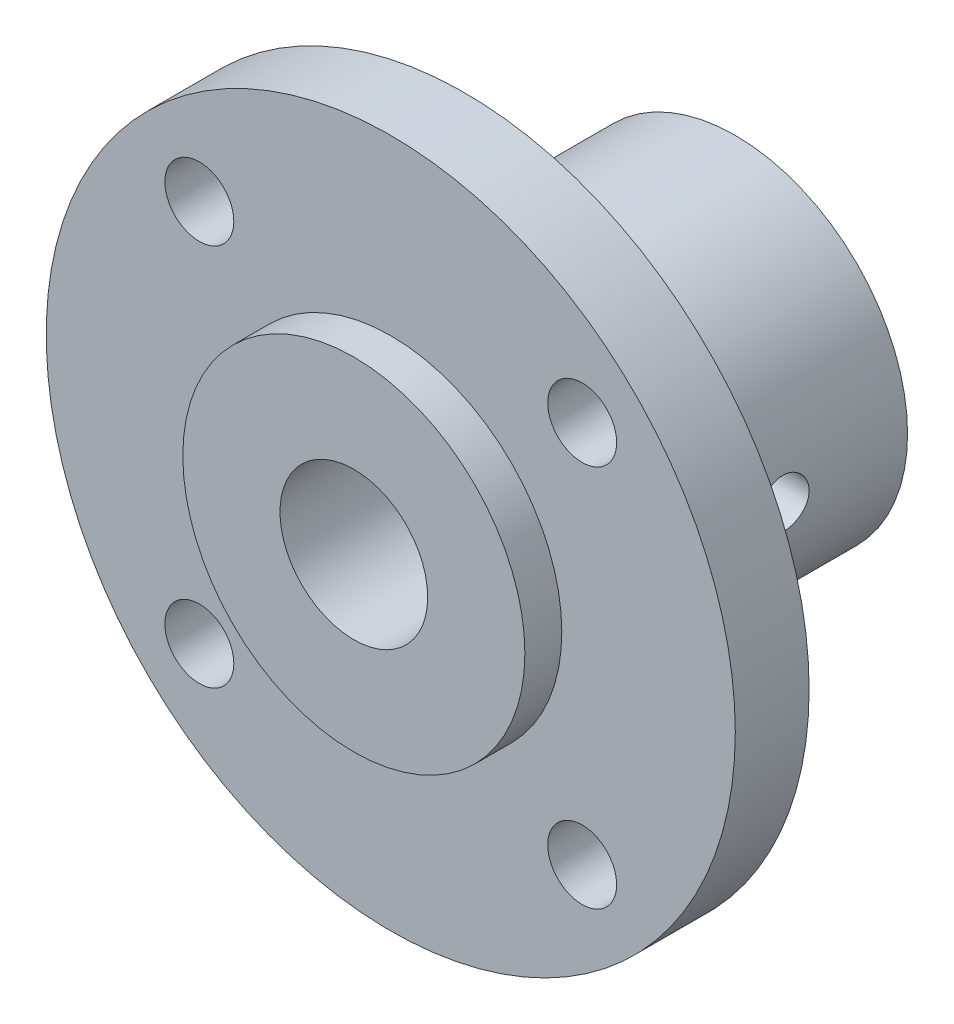
ISO-10303-21;
HEADER;
FILE_DESCRIPTION(('STEP AP214'),'2;1');
FILE_NAME('part.step','',(''),(''),'','','');
FILE_SCHEMA(('AUTOMOTIVE_DESIGN { 1 0 10303 214 1 1 1 1 }'));
ENDSEC;
DATA;
#1=APPLICATION_CONTEXT('core data for automotive mechanical design processes');
#2=APPLICATION_PROTOCOL_DEFINITION('international standard','automotive_design',2000,#1);
#3=PRODUCT_CONTEXT('',#1,'mechanical');
#4=PRODUCT('Part','Part','',(#3));
#5=PRODUCT_RELATED_PRODUCT_CATEGORY('part','',(#4));
#6=PRODUCT_DEFINITION_FORMATION('','',#4);
#7=PRODUCT_DEFINITION_CONTEXT('part definition',#1,'design');
#8=PRODUCT_DEFINITION('design','',#6,#7);
#9=PRODUCT_DEFINITION_SHAPE('','',#8);
#10=(LENGTH_UNIT() NAMED_UNIT(*) SI_UNIT(.MILLI.,.METRE.));
#11=(NAMED_UNIT(*) PLANE_ANGLE_UNIT() SI_UNIT($,.RADIAN.));
#12=(NAMED_UNIT(*) SI_UNIT($,.STERADIAN.) SOLID_ANGLE_UNIT());
#13=UNCERTAINTY_MEASURE_WITH_UNIT(LENGTH_MEASURE(1.E-05),#10,'distance_accuracy_value','');
#14=(GEOMETRIC_REPRESENTATION_CONTEXT(3) GLOBAL_UNCERTAINTY_ASSIGNED_CONTEXT((#13)) GLOBAL_UNIT_ASSIGNED_CONTEXT((#10,
#11,#12)) REPRESENTATION_CONTEXT('',''));
#15=CARTESIAN_POINT('',(0.,0.,0.));
#16=DIRECTION('',(0.,0.,1.));
#17=DIRECTION('',(1.,0.,0.));
#18=AXIS2_PLACEMENT_3D('',#15,#16,#17);
#19=CARTESIAN_POINT('',(0.,0.,3.));
#20=DIRECTION('',(0.,0.,-1.));
#21=DIRECTION('',(-1.,0.,0.));
#22=AXIS2_PLACEMENT_3D('',#19,#20,#21);
#23=CYLINDRICAL_SURFACE('',#22,14.);
#24=CARTESIAN_POINT('',(0.,0.,3.));
#25=DIRECTION('',(0.,0.,1.));
#26=DIRECTION('',(1.,0.,0.));
#27=AXIS2_PLACEMENT_3D('',#24,#25,#26);
#28=CIRCLE('',#27,14.);
#29=CARTESIAN_POINT('',(14.,0.,3.));
#30=VERTEX_POINT('',#29);
#31=EDGE_CURVE('E51',#30,#30,#28,.T.);
#32=ORIENTED_EDGE('',*,*,#31,.F.);
#33=EDGE_LOOP('',(#32));
#34=FACE_BOUND('',#33,.T.);
#35=CARTESIAN_POINT('',(0.,0.,0.));
#36=DIRECTION('',(0.,0.,1.));
#37=DIRECTION('',(1.,0.,0.));
#38=AXIS2_PLACEMENT_3D('',#35,#36,#37);
#39=CIRCLE('',#38,14.);
#40=CARTESIAN_POINT('',(14.,0.,0.));
#41=VERTEX_POINT('',#40);
#42=EDGE_CURVE('E57',#41,#41,#39,.T.);
#43=ORIENTED_EDGE('',*,*,#42,.T.);
#44=EDGE_LOOP('',(#43));
#45=FACE_BOUND('',#44,.T.);
#46=ADVANCED_FACE('F39',(#34,#45),#23,.T.);
#47=CARTESIAN_POINT('',(0.,0.,3.));
#48=DIRECTION('',(0.,0.,1.));
#49=DIRECTION('',(1.,0.,0.));
#50=AXIS2_PLACEMENT_3D('',#47,#48,#49);
#51=PLANE('',#50);
#52=CARTESIAN_POINT('',(7.77817459305202,-7.77817459305202,3.));
#53=DIRECTION('',(0.,0.,1.));
#54=DIRECTION('',(1.,0.,0.));
#55=AXIS2_PLACEMENT_3D('',#52,#53,#54);
#56=CIRCLE('',#55,1.4);
#57=CARTESIAN_POINT('',(9.17817459305202,-7.77817459305202,3.));
#58=VERTEX_POINT('',#57);
#59=EDGE_CURVE('E241',#58,#58,#56,.T.);
#60=ORIENTED_EDGE('',*,*,#59,.F.);
#61=EDGE_LOOP('',(#60));
#62=FACE_BOUND('',#61,.T.);
#63=CARTESIAN_POINT('',(-7.77817459305202,-7.77817459305202,3.));
#64=DIRECTION('',(0.,0.,1.));
#65=DIRECTION('',(1.,0.,0.));
#66=AXIS2_PLACEMENT_3D('',#63,#64,#65);
#67=CIRCLE('',#66,1.4);
#68=CARTESIAN_POINT('',(-6.37817459305202,-7.77817459305202,3.));
#69=VERTEX_POINT('',#68);
#70=EDGE_CURVE('E253',#69,#69,#67,.T.);
#71=ORIENTED_EDGE('',*,*,#70,.F.);
#72=EDGE_LOOP('',(#71));
#73=FACE_BOUND('',#72,.T.);
#74=CARTESIAN_POINT('',(-7.77817459305202,7.77817459305202,3.));
#75=DIRECTION('',(0.,0.,1.));
#76=DIRECTION('',(1.,0.,0.));
#77=AXIS2_PLACEMENT_3D('',#74,#75,#76);
#78=CIRCLE('',#77,1.4);
#79=CARTESIAN_POINT('',(-6.37817459305202,7.77817459305202,3.));
#80=VERTEX_POINT('',#79);
#81=EDGE_CURVE('E266',#80,#80,#78,.T.);
#82=ORIENTED_EDGE('',*,*,#81,.F.);
#83=EDGE_LOOP('',(#82));
#84=FACE_BOUND('',#83,.T.);
#85=CARTESIAN_POINT('',(7.77817459305202,7.77817459305202,3.));
#86=DIRECTION('',(0.,0.,1.));
#87=DIRECTION('',(1.,0.,0.));
#88=AXIS2_PLACEMENT_3D('',#85,#86,#87);
#89=CIRCLE('',#88,1.4);
#90=CARTESIAN_POINT('',(9.17817459305203,7.77817459305202,3.));
#91=VERTEX_POINT('',#90);
#92=EDGE_CURVE('E267',#91,#91,#89,.T.);
#93=ORIENTED_EDGE('',*,*,#92,.F.);
#94=EDGE_LOOP('',(#93));
#95=FACE_BOUND('',#94,.T.);
#96=CARTESIAN_POINT('',(0.,0.,3.));
#97=DIRECTION('',(0.,0.,1.));
#98=DIRECTION('',(1.,0.,0.));
#99=AXIS2_PLACEMENT_3D('',#96,#97,#98);
#100=CIRCLE('',#99,6.95);
#101=CARTESIAN_POINT('',(6.95,0.,3.));
#102=VERTEX_POINT('',#101);
#103=EDGE_CURVE('E10',#102,#102,#100,.T.);
#104=ORIENTED_EDGE('',*,*,#103,.F.);
#105=EDGE_LOOP('',(#104));
#106=FACE_BOUND('',#105,.T.);
#107=ORIENTED_EDGE('',*,*,#31,.T.);
#108=EDGE_LOOP('',(#107));
#109=FACE_BOUND('',#108,.T.);
#110=ADVANCED_FACE('F115',(#62,#73,#84,#95,#106,#109),#51,.T.);
#111=CARTESIAN_POINT('',(0.,0.,0.));
#112=DIRECTION('',(0.,0.,1.));
#113=DIRECTION('',(1.,0.,0.));
#114=AXIS2_PLACEMENT_3D('',#111,#112,#113);
#115=PLANE('',#114);
#116=CARTESIAN_POINT('',(7.77817459305202,-7.77817459305202,0.));
#117=DIRECTION('',(0.,0.,-1.));
#118=DIRECTION('',(-1.,0.,0.));
#119=AXIS2_PLACEMENT_3D('',#116,#117,#118);
#120=CIRCLE('',#119,1.4);
#121=CARTESIAN_POINT('',(6.37817459305202,-7.77817459305202,0.));
#122=VERTEX_POINT('',#121);
#123=EDGE_CURVE('E276',#122,#122,#120,.T.);
#124=ORIENTED_EDGE('',*,*,#123,.F.);
#125=EDGE_LOOP('',(#124));
#126=FACE_BOUND('',#125,.T.);
#127=CARTESIAN_POINT('',(-7.77817459305202,-7.77817459305202,0.));
#128=DIRECTION('',(0.,0.,-1.));
#129=DIRECTION('',(-1.,0.,0.));
#130=AXIS2_PLACEMENT_3D('',#127,#128,#129);
#131=CIRCLE('',#130,1.4);
#132=CARTESIAN_POINT('',(-9.17817459305203,-7.77817459305202,0.));
#133=VERTEX_POINT('',#132);
#134=EDGE_CURVE('E278',#133,#133,#131,.T.);
#135=ORIENTED_EDGE('',*,*,#134,.F.);
#136=EDGE_LOOP('',(#135));
#137=FACE_BOUND('',#136,.T.);
#138=CARTESIAN_POINT('',(-7.77817459305202,7.77817459305202,0.));
#139=DIRECTION('',(0.,0.,-1.));
#140=DIRECTION('',(-1.,0.,0.));
#141=AXIS2_PLACEMENT_3D('',#138,#139,#140);
#142=CIRCLE('',#141,1.4);
#143=CARTESIAN_POINT('',(-9.17817459305202,7.77817459305202,0.));
#144=VERTEX_POINT('',#143);
#145=EDGE_CURVE('E274',#144,#144,#142,.T.);
#146=ORIENTED_EDGE('',*,*,#145,.F.);
#147=EDGE_LOOP('',(#146));
#148=FACE_BOUND('',#147,.T.);
#149=CARTESIAN_POINT('',(7.77817459305202,7.77817459305202,0.));
#150=DIRECTION('',(0.,0.,-1.));
#151=DIRECTION('',(-1.,0.,0.));
#152=AXIS2_PLACEMENT_3D('',#149,#150,#151);
#153=CIRCLE('',#152,1.4);
#154=CARTESIAN_POINT('',(6.37817459305202,7.77817459305202,0.));
#155=VERTEX_POINT('',#154);
#156=EDGE_CURVE('E275',#155,#155,#153,.T.);
#157=ORIENTED_EDGE('',*,*,#156,.F.);
#158=EDGE_LOOP('',(#157));
#159=FACE_BOUND('',#158,.T.);
#160=CARTESIAN_POINT('',(0.,0.,0.));
#161=DIRECTION('',(0.,0.,1.));
#162=DIRECTION('',(1.,0.,0.));
#163=AXIS2_PLACEMENT_3D('',#160,#161,#162);
#164=CIRCLE('',#163,7.);
#165=CARTESIAN_POINT('',(7.,0.,0.));
#166=VERTEX_POINT('',#165);
#167=EDGE_CURVE('E247',#166,#166,#164,.T.);
#168=ORIENTED_EDGE('',*,*,#167,.T.);
#169=EDGE_LOOP('',(#168));
#170=FACE_BOUND('',#169,.T.);
#171=ORIENTED_EDGE('',*,*,#42,.F.);
#172=EDGE_LOOP('',(#171));
#173=FACE_BOUND('',#172,.T.);
#174=ADVANCED_FACE('F109',(#126,#137,#148,#159,#170,#173),#115,.F.);
#175=CARTESIAN_POINT('',(0.,0.,4.5));
#176=DIRECTION('',(0.,0.,-1.));
#177=DIRECTION('',(-1.,0.,0.));
#178=AXIS2_PLACEMENT_3D('',#175,#176,#177);
#179=CYLINDRICAL_SURFACE('',#178,6.95);
#180=CARTESIAN_POINT('',(0.,0.,4.5));
#181=DIRECTION('',(0.,0.,1.));
#182=DIRECTION('',(1.,0.,0.));
#183=AXIS2_PLACEMENT_3D('',#180,#181,#182);
#184=CIRCLE('',#183,6.95);
#185=CARTESIAN_POINT('',(6.95,0.,4.5));
#186=VERTEX_POINT('',#185);
#187=EDGE_CURVE('E56',#186,#186,#184,.T.);
#188=ORIENTED_EDGE('',*,*,#187,.F.);
#189=EDGE_LOOP('',(#188));
#190=FACE_BOUND('',#189,.T.);
#191=ORIENTED_EDGE('',*,*,#103,.T.);
#192=EDGE_LOOP('',(#191));
#193=FACE_BOUND('',#192,.T.);
#194=ADVANCED_FACE('F108',(#190,#193),#179,.T.);
#195=CARTESIAN_POINT('',(0.,0.,4.5));
#196=DIRECTION('',(0.,0.,1.));
#197=DIRECTION('',(1.,0.,0.));
#198=AXIS2_PLACEMENT_3D('',#195,#196,#197);
#199=PLANE('',#198);
#200=CARTESIAN_POINT('',(0.,0.,4.5));
#201=DIRECTION('',(0.,0.,1.));
#202=DIRECTION('',(1.,0.,0.));
#203=AXIS2_PLACEMENT_3D('',#200,#201,#202);
#204=CIRCLE('',#203,3.);
#205=CARTESIAN_POINT('',(3.,0.,4.5));
#206=VERTEX_POINT('',#205);
#207=EDGE_CURVE('E236',#206,#206,#204,.T.);
#208=ORIENTED_EDGE('',*,*,#207,.F.);
#209=EDGE_LOOP('',(#208));
#210=FACE_BOUND('',#209,.T.);
#211=ORIENTED_EDGE('',*,*,#187,.T.);
#212=EDGE_LOOP('',(#211));
#213=FACE_BOUND('',#212,.T.);
#214=ADVANCED_FACE('F103',(#210,#213),#199,.T.);
#215=CARTESIAN_POINT('',(0.,0.,0.));
#216=DIRECTION('',(0.,0.,1.));
#217=DIRECTION('',(1.,0.,0.));
#218=AXIS2_PLACEMENT_3D('',#215,#216,#217);
#219=CYLINDRICAL_SURFACE('',#218,3.);
#220=CARTESIAN_POINT('',(3.,0.,-7.));
#221=CARTESIAN_POINT('',(3.00000015300943,0.0545633628867233,-7.00000025373164));
#222=CARTESIAN_POINT('',(2.99849769507545,0.10912519453855,-6.99551973387278));
#223=CARTESIAN_POINT('',(2.99265210203281,0.216641760872972,-6.97777089118278));
#224=CARTESIAN_POINT('',(2.98830867202153,0.269596328118818,-6.96450165605108));
#225=CARTESIAN_POINT('',(2.97725307906443,0.372332789501776,-6.92968075661595));
#226=CARTESIAN_POINT('',(2.97054487730853,0.422119825886034,-6.90814293754073));
#227=CARTESIAN_POINT('',(2.95544445717342,0.517374936805325,-6.85745882716165));
#228=CARTESIAN_POINT('',(2.94705190667778,0.562842156958706,-6.8283110349974));
#229=CARTESIAN_POINT('',(2.92914094443005,0.649741675022266,-6.76217419514125));
#230=CARTESIAN_POINT('',(2.91959556463785,0.691003700298309,-6.72496876573951));
#231=CARTESIAN_POINT('',(2.90060314783122,0.766832692702084,-6.64423284529343));
#232=CARTESIAN_POINT('',(2.89115613290549,0.801398185489462,-6.60070096507149));
#233=CARTESIAN_POINT('',(2.87313332477274,0.863824942227859,-6.50701488480354));
#234=CARTESIAN_POINT('',(2.86459039275688,0.891464858221032,-6.45670626026788));
#235=CARTESIAN_POINT('',(2.84975305418601,0.937818873877721,-6.35182390554145));
#236=CARTESIAN_POINT('',(2.84345796160746,0.956535697386765,-6.29725148283726));
#237=CARTESIAN_POINT('',(2.83411303269377,0.983873461509163,-6.18732677850329));
#238=CARTESIAN_POINT('',(2.83096095769611,0.992813448271769,-6.13206279151093));
#239=CARTESIAN_POINT('',(2.82795656629508,1.00134112333448,-6.02073624584412));
#240=CARTESIAN_POINT('',(2.8281032302273,1.00093170160472,-5.96467393929081));
#241=CARTESIAN_POINT('',(2.8315901500818,0.991019903703419,-5.85606336955598));
#242=CARTESIAN_POINT('',(2.83478415867533,0.981933913166995,-5.80347159708098));
#243=CARTESIAN_POINT('',(2.84376657724551,0.955606162849417,-5.70060658039317));
#244=CARTESIAN_POINT('',(2.84955529784108,0.938363426591871,-5.65033361456493));
#245=CARTESIAN_POINT('',(2.86317911131249,0.895939058060212,-5.55258725040852));
#246=CARTESIAN_POINT('',(2.87104565793117,0.870634048707263,-5.50517197453047));
#247=CARTESIAN_POINT('',(2.88792558575726,0.812889106303139,-5.41512909172028));
#248=CARTESIAN_POINT('',(2.89693929790464,0.780447112364006,-5.37250287306662));
#249=CARTESIAN_POINT('',(2.91567329167741,0.707349332682238,-5.29090840183923));
#250=CARTESIAN_POINT('',(2.92540589354843,0.666353150076312,-5.25224730549093));
#251=CARTESIAN_POINT('',(2.94406938387037,0.578339569970064,-5.1822687333366));
#252=CARTESIAN_POINT('',(2.95300019538067,0.531321595660815,-5.1509519618355));
#253=CARTESIAN_POINT('',(2.96917107937794,0.431947613046268,-5.09630369976493));
#254=CARTESIAN_POINT('',(2.97639350008039,0.379543276416337,-5.07305450865927));
#255=CARTESIAN_POINT('',(2.98820567144435,0.271269083364508,-5.03579682604429));
#256=CARTESIAN_POINT('',(2.99279633654879,0.215400438154954,-5.02178512457656));
#257=CARTESIAN_POINT('',(2.99867627071441,0.104383829529304,-5.00394433397764));
#258=CARTESIAN_POINT('',(3.00010001833731,0.0493095998648454,-4.99970019082725));
#259=CARTESIAN_POINT('',(2.99988902694825,-0.0607750699602364,-5.00033267359847));
#260=CARTESIAN_POINT('',(2.99825480419352,-0.115785519319647,-5.00520775997987));
#261=CARTESIAN_POINT('',(2.99220024717114,-0.222519866304259,-5.02361190773597));
#262=CARTESIAN_POINT('',(2.98786198711228,-0.274292806834856,-5.03688620604952));
#263=CARTESIAN_POINT('',(2.97691846830034,-0.374855958579561,-5.0713934444667));
#264=CARTESIAN_POINT('',(2.97031292046541,-0.423645788508559,-5.09262739946768));
#265=CARTESIAN_POINT('',(2.95528931287427,-0.518288296393321,-5.1430704318409));
#266=CARTESIAN_POINT('',(2.94682814756305,-0.564029959217329,-5.1724745932836));
#267=CARTESIAN_POINT('',(2.92905253915743,-0.650064830135404,-5.23819415001305));
#268=CARTESIAN_POINT('',(2.91973783591888,-0.690356367794894,-5.27451165603016));
#269=CARTESIAN_POINT('',(2.90076847982472,-0.766252507807013,-5.35497875100826));
#270=CARTESIAN_POINT('',(2.89111761095155,-0.801560969248491,-5.39940922693325));
#271=CARTESIAN_POINT('',(2.87299973286981,-0.864257522320854,-5.4937715678045));
#272=CARTESIAN_POINT('',(2.8645327335312,-0.891645547920843,-5.5437034786102));
#273=CARTESIAN_POINT('',(2.84982391820308,-0.937596930423361,-5.6476730153066));
#274=CARTESIAN_POINT('',(2.84357760900632,-0.956178132197766,-5.70170207924278));
#275=CARTESIAN_POINT('',(2.83410832399133,-0.983894666792163,-5.81237865012415));
#276=CARTESIAN_POINT('',(2.83088398622698,-0.993034254961243,-5.86902496543306));
#277=CARTESIAN_POINT('',(2.82797858875071,-1.00127628247038,-5.98019709601321));
#278=CARTESIAN_POINT('',(2.82812400344299,-1.00087025731093,-6.03468234025174));
#279=CARTESIAN_POINT('',(2.8315126992356,-0.991242293454878,-6.14276507489974));
#280=CARTESIAN_POINT('',(2.83475579595884,-0.982020879458887,-6.19636261795291));
#281=CARTESIAN_POINT('',(2.84384524278943,-0.95537181312698,-6.30013566301267));
#282=CARTESIAN_POINT('',(2.84964098015514,-0.93810334601488,-6.35035682500723));
#283=CARTESIAN_POINT('',(2.86316398825434,-0.895979365760382,-6.44722740693553));
#284=CARTESIAN_POINT('',(2.87089168765297,-0.871122168553979,-6.49387603118726));
#285=CARTESIAN_POINT('',(2.8878282922406,-0.813260692583249,-6.58448366992369));
#286=CARTESIAN_POINT('',(2.89708711641604,-0.779948242764532,-6.62823650189859));
#287=CARTESIAN_POINT('',(2.91583356283786,-0.706642883135697,-6.70968981338399));
#288=CARTESIAN_POINT('',(2.92532124912518,-0.666648084451495,-6.74738857568802));
#289=CARTESIAN_POINT('',(2.94390030525393,-0.579241556920674,-6.81714441228924));
#290=CARTESIAN_POINT('',(2.95296181801216,-0.531601513499725,-6.84892434775102));
#291=CARTESIAN_POINT('',(2.96925991172652,-0.431357357406628,-6.90399042885063));
#292=CARTESIAN_POINT('',(2.9764969590794,-0.378754518132349,-6.92727874592204));
#293=CARTESIAN_POINT('',(2.98805515068532,-0.272493647200975,-6.96372163248868));
#294=CARTESIAN_POINT('',(2.9924921242252,-0.218987757676408,-6.97728246626338));
#295=CARTESIAN_POINT('',(2.99846407064225,-0.110320416010247,-6.99542028067713));
#296=CARTESIAN_POINT('',(2.99999984531906,-0.0551594255687463,-6.99999974349654));
#297=CARTESIAN_POINT('',(3.,0.,-7.));
#298=B_SPLINE_CURVE_WITH_KNOTS('',3,(#220,#221,#222,#223,#224,#225,#226,#227,#228,#229,#230,
#231,#232,#233,#234,#235,#236,#237,#238,#239,#240,#241,#242,#243,#244,#245,#246,#247,#248,#249,
#250,#251,#252,#253,#254,#255,#256,#257,#258,#259,#260,#261,#262,#263,#264,#265,#266,#267,#268,
#269,#270,#271,#272,#273,#274,#275,#276,#277,#278,#279,#280,#281,#282,#283,#284,#285,#286,#287,
#288,#289,#290,#291,#292,#293,#294,#295,#296,#297),.UNSPECIFIED.,.T.,.F.,(4,2,2,2,2,2,2,2,2,2,2,
2,2,2,2,2,2,2,2,2,2,2,2,2,2,2,2,2,2,2,2,2,2,2,2,2,2,2,4),(0.,0.163487106026011,
0.326991185267521,0.490222672870274,0.6534863777991,0.82184684282756,0.990244332875302,
1.1634838482347,1.33667044692833,1.5040192574184,1.67131633987485,1.8309682655128,
1.99063930855482,2.15288171155131,2.31517102558207,2.48593305811367,2.65671145966618,
2.82918405650357,3.00159668877208,3.1665358317517,3.33144713164177,3.49158157978213,
3.65173645284104,3.81610399843736,3.98052180821891,4.15241022880752,4.32430008234997,
4.49584013824417,4.66730284700846,4.82995666056619,4.99260079341185,5.15215587070227,
5.31174638165788,5.47830066681615,5.64490211113589,5.8179966082491,5.99104681142266,
6.15636558363624,6.3216386602795),.UNSPECIFIED.);
#299=CARTESIAN_POINT('',(3.,0.,-7.));
#300=VERTEX_POINT('',#299);
#301=EDGE_CURVE('E92',#300,#300,#298,.T.);
#302=ORIENTED_EDGE('',*,*,#301,.T.);
#303=EDGE_LOOP('',(#302));
#304=FACE_BOUND('',#303,.T.);
#305=CARTESIAN_POINT('',(-3.,0.,-7.));
#306=CARTESIAN_POINT('',(-3.00000015300943,-0.0545633628867233,-7.00000025373164));
#307=CARTESIAN_POINT('',(-2.99849769507545,-0.10912519453855,-6.99551973387278));
#308=CARTESIAN_POINT('',(-2.99265210203281,-0.216641760872972,-6.97777089118278));
#309=CARTESIAN_POINT('',(-2.98830867202153,-0.269596328118818,-6.96450165605108));
#310=CARTESIAN_POINT('',(-2.97725307906443,-0.372332789501776,-6.92968075661595));
#311=CARTESIAN_POINT('',(-2.97054487730853,-0.422119825886034,-6.90814293754073));
#312=CARTESIAN_POINT('',(-2.95544445717342,-0.517374936805325,-6.85745882716165));
#313=CARTESIAN_POINT('',(-2.94705190667778,-0.562842156958706,-6.8283110349974));
#314=CARTESIAN_POINT('',(-2.92914094443005,-0.649741675022266,-6.76217419514125));
#315=CARTESIAN_POINT('',(-2.91959556463785,-0.691003700298309,-6.72496876573951));
#316=CARTESIAN_POINT('',(-2.90060314783122,-0.766832692702084,-6.64423284529343));
#317=CARTESIAN_POINT('',(-2.89115613290549,-0.801398185489462,-6.60070096507149));
#318=CARTESIAN_POINT('',(-2.87313332477274,-0.863824942227859,-6.50701488480354));
#319=CARTESIAN_POINT('',(-2.86459039275688,-0.891464858221032,-6.45670626026788));
#320=CARTESIAN_POINT('',(-2.84975305418601,-0.937818873877721,-6.35182390554145));
#321=CARTESIAN_POINT('',(-2.84345796160746,-0.956535697386765,-6.29725148283726));
#322=CARTESIAN_POINT('',(-2.83411303269377,-0.983873461509163,-6.18732677850329));
#323=CARTESIAN_POINT('',(-2.83096095769611,-0.992813448271769,-6.13206279151093));
#324=CARTESIAN_POINT('',(-2.82795656629508,-1.00134112333448,-6.02073624584412));
#325=CARTESIAN_POINT('',(-2.8281032302273,-1.00093170160472,-5.96467393929081));
#326=CARTESIAN_POINT('',(-2.8315901500818,-0.991019903703419,-5.85606336955598));
#327=CARTESIAN_POINT('',(-2.83478415867533,-0.981933913166995,-5.80347159708098));
#328=CARTESIAN_POINT('',(-2.84376657724551,-0.955606162849417,-5.70060658039317));
#329=CARTESIAN_POINT('',(-2.84955529784108,-0.938363426591871,-5.65033361456493));
#330=CARTESIAN_POINT('',(-2.86317911131249,-0.895939058060212,-5.55258725040852));
#331=CARTESIAN_POINT('',(-2.87104565793117,-0.870634048707263,-5.50517197453047));
#332=CARTESIAN_POINT('',(-2.88792558575726,-0.812889106303139,-5.41512909172028));
#333=CARTESIAN_POINT('',(-2.89693929790464,-0.780447112364006,-5.37250287306662));
#334=CARTESIAN_POINT('',(-2.91567329167741,-0.707349332682238,-5.29090840183923));
#335=CARTESIAN_POINT('',(-2.92540589354843,-0.666353150076312,-5.25224730549093));
#336=CARTESIAN_POINT('',(-2.94406938387037,-0.578339569970064,-5.1822687333366));
#337=CARTESIAN_POINT('',(-2.95300019538067,-0.531321595660815,-5.1509519618355));
#338=CARTESIAN_POINT('',(-2.96917107937794,-0.431947613046268,-5.09630369976493));
#339=CARTESIAN_POINT('',(-2.97639350008039,-0.379543276416337,-5.07305450865927));
#340=CARTESIAN_POINT('',(-2.98820567144435,-0.271269083364508,-5.03579682604429));
#341=CARTESIAN_POINT('',(-2.99279633654879,-0.215400438154954,-5.02178512457656));
#342=CARTESIAN_POINT('',(-2.99867627071441,-0.104383829529304,-5.00394433397764));
#343=CARTESIAN_POINT('',(-3.00010001833731,-0.0493095998648454,-4.99970019082725));
#344=CARTESIAN_POINT('',(-2.99988902694825,0.0607750699602364,-5.00033267359847));
#345=CARTESIAN_POINT('',(-2.99825480419352,0.115785519319647,-5.00520775997987));
#346=CARTESIAN_POINT('',(-2.99220024717114,0.222519866304259,-5.02361190773597));
#347=CARTESIAN_POINT('',(-2.98786198711228,0.274292806834856,-5.03688620604952));
#348=CARTESIAN_POINT('',(-2.97691846830034,0.374855958579561,-5.0713934444667));
#349=CARTESIAN_POINT('',(-2.97031292046541,0.423645788508559,-5.09262739946768));
#350=CARTESIAN_POINT('',(-2.95528931287427,0.518288296393321,-5.1430704318409));
#351=CARTESIAN_POINT('',(-2.94682814756305,0.564029959217329,-5.1724745932836));
#352=CARTESIAN_POINT('',(-2.92905253915743,0.650064830135404,-5.23819415001305));
#353=CARTESIAN_POINT('',(-2.91973783591888,0.690356367794894,-5.27451165603016));
#354=CARTESIAN_POINT('',(-2.90076847982472,0.766252507807013,-5.35497875100826));
#355=CARTESIAN_POINT('',(-2.89111761095155,0.801560969248491,-5.39940922693325));
#356=CARTESIAN_POINT('',(-2.87299973286981,0.864257522320854,-5.4937715678045));
#357=CARTESIAN_POINT('',(-2.8645327335312,0.891645547920843,-5.5437034786102));
#358=CARTESIAN_POINT('',(-2.84982391820308,0.937596930423361,-5.6476730153066));
#359=CARTESIAN_POINT('',(-2.84357760900632,0.956178132197766,-5.70170207924278));
#360=CARTESIAN_POINT('',(-2.83410832399133,0.983894666792163,-5.81237865012415));
#361=CARTESIAN_POINT('',(-2.83088398622698,0.993034254961243,-5.86902496543306));
#362=CARTESIAN_POINT('',(-2.82797858875071,1.00127628247038,-5.98019709601321));
#363=CARTESIAN_POINT('',(-2.82812400344299,1.00087025731093,-6.03468234025174));
#364=CARTESIAN_POINT('',(-2.8315126992356,0.991242293454878,-6.14276507489974));
#365=CARTESIAN_POINT('',(-2.83475579595884,0.982020879458887,-6.19636261795291));
#366=CARTESIAN_POINT('',(-2.84384524278943,0.95537181312698,-6.30013566301267));
#367=CARTESIAN_POINT('',(-2.84964098015514,0.93810334601488,-6.35035682500723));
#368=CARTESIAN_POINT('',(-2.86316398825434,0.895979365760382,-6.44722740693553));
#369=CARTESIAN_POINT('',(-2.87089168765297,0.871122168553979,-6.49387603118726));
#370=CARTESIAN_POINT('',(-2.8878282922406,0.813260692583249,-6.58448366992369));
#371=CARTESIAN_POINT('',(-2.89708711641604,0.779948242764532,-6.62823650189859));
#372=CARTESIAN_POINT('',(-2.91583356283786,0.706642883135697,-6.70968981338399));
#373=CARTESIAN_POINT('',(-2.92532124912518,0.666648084451495,-6.74738857568802));
#374=CARTESIAN_POINT('',(-2.94390030525393,0.579241556920674,-6.81714441228924));
#375=CARTESIAN_POINT('',(-2.95296181801216,0.531601513499725,-6.84892434775102));
#376=CARTESIAN_POINT('',(-2.96925991172652,0.431357357406628,-6.90399042885063));
#377=CARTESIAN_POINT('',(-2.9764969590794,0.378754518132349,-6.92727874592204));
#378=CARTESIAN_POINT('',(-2.98805515068532,0.272493647200975,-6.96372163248868));
#379=CARTESIAN_POINT('',(-2.9924921242252,0.218987757676408,-6.97728246626338));
#380=CARTESIAN_POINT('',(-2.99846407064225,0.110320416010247,-6.99542028067713));
#381=CARTESIAN_POINT('',(-2.99999984531906,0.0551594255687463,-6.99999974349654));
#382=CARTESIAN_POINT('',(-3.,0.,-7.));
#383=B_SPLINE_CURVE_WITH_KNOTS('',3,(#305,#306,#307,#308,#309,#310,#311,#312,#313,#314,#315,
#316,#317,#318,#319,#320,#321,#322,#323,#324,#325,#326,#327,#328,#329,#330,#331,#332,#333,#334,
#335,#336,#337,#338,#339,#340,#341,#342,#343,#344,#345,#346,#347,#348,#349,#350,#351,#352,#353,
#354,#355,#356,#357,#358,#359,#360,#361,#362,#363,#364,#365,#366,#367,#368,#369,#370,#371,#372,
#373,#374,#375,#376,#377,#378,#379,#380,#381,#382),.UNSPECIFIED.,.T.,.F.,(4,2,2,2,2,2,2,2,2,2,2,
2,2,2,2,2,2,2,2,2,2,2,2,2,2,2,2,2,2,2,2,2,2,2,2,2,2,2,4),(0.,0.163487106026011,
0.326991185267521,0.490222672870274,0.6534863777991,0.82184684282756,0.990244332875302,
1.1634838482347,1.33667044692833,1.5040192574184,1.67131633987485,1.8309682655128,
1.99063930855482,2.15288171155131,2.31517102558207,2.48593305811367,2.65671145966618,
2.82918405650357,3.00159668877208,3.1665358317517,3.33144713164177,3.49158157978213,
3.65173645284104,3.81610399843736,3.98052180821891,4.15241022880752,4.32430008234997,
4.49584013824417,4.66730284700846,4.82995666056619,4.99260079341185,5.15215587070227,
5.31174638165788,5.47830066681615,5.64490211113589,5.8179966082491,5.99104681142266,
6.15636558363624,6.3216386602795),.UNSPECIFIED.);
#384=CARTESIAN_POINT('',(-3.,0.,-7.));
#385=VERTEX_POINT('',#384);
#386=EDGE_CURVE('E87',#385,#385,#383,.T.);
#387=ORIENTED_EDGE('',*,*,#386,.T.);
#388=EDGE_LOOP('',(#387));
#389=FACE_BOUND('',#388,.T.);
#390=ORIENTED_EDGE('',*,*,#207,.T.);
#391=EDGE_LOOP('',(#390));
#392=FACE_BOUND('',#391,.T.);
#393=CARTESIAN_POINT('',(0.,0.,-11.));
#394=DIRECTION('',(0.,0.,1.));
#395=DIRECTION('',(1.,0.,0.));
#396=AXIS2_PLACEMENT_3D('',#393,#394,#395);
#397=CIRCLE('',#396,3.);
#398=CARTESIAN_POINT('',(3.,0.,-11.));
#399=VERTEX_POINT('',#398);
#400=EDGE_CURVE('E245',#399,#399,#397,.T.);
#401=ORIENTED_EDGE('',*,*,#400,.F.);
#402=EDGE_LOOP('',(#401));
#403=FACE_BOUND('',#402,.T.);
#404=ADVANCED_FACE('F98',(#304,#389,#392,#403),#219,.F.);
#405=CARTESIAN_POINT('',(0.,0.,-11.));
#406=DIRECTION('',(0.,0.,1.));
#407=DIRECTION('',(1.,0.,0.));
#408=AXIS2_PLACEMENT_3D('',#405,#406,#407);
#409=PLANE('',#408);
#410=CARTESIAN_POINT('',(0.,0.,-11.));
#411=DIRECTION('',(0.,0.,1.));
#412=DIRECTION('',(1.,0.,0.));
#413=AXIS2_PLACEMENT_3D('',#410,#411,#412);
#414=CIRCLE('',#413,7.);
#415=CARTESIAN_POINT('',(7.,0.,-11.));
#416=VERTEX_POINT('',#415);
#417=EDGE_CURVE('E244',#416,#416,#414,.T.);
#418=ORIENTED_EDGE('',*,*,#417,.F.);
#419=EDGE_LOOP('',(#418));
#420=FACE_BOUND('',#419,.T.);
#421=ORIENTED_EDGE('',*,*,#400,.T.);
#422=EDGE_LOOP('',(#421));
#423=FACE_BOUND('',#422,.T.);
#424=ADVANCED_FACE('F96',(#420,#423),#409,.F.);
#425=CARTESIAN_POINT('',(0.,0.,0.));
#426=DIRECTION('',(0.,0.,-1.));
#427=DIRECTION('',(-1.,0.,0.));
#428=AXIS2_PLACEMENT_3D('',#425,#426,#427);
#429=CYLINDRICAL_SURFACE('',#428,7.);
#430=CARTESIAN_POINT('',(-7.,0.,-5.));
#431=CARTESIAN_POINT('',(-6.99999913522882,-0.0558653647064107,-5.00000232658881));
#432=CARTESIAN_POINT('',(-6.99932420200296,-0.111763905495517,-5.0046972071594));
#433=CARTESIAN_POINT('',(-6.99669670505877,-0.222000660368081,-5.02334913623399));
#434=CARTESIAN_POINT('',(-6.99474286996306,-0.276337265533478,-5.03731540177038));
#435=CARTESIAN_POINT('',(-6.98977730161823,-0.381838676785442,-5.07408606173423));
#436=CARTESIAN_POINT('',(-6.98676634168295,-0.433005769349771,-5.09688399682651));
#437=CARTESIAN_POINT('',(-6.98001989080586,-0.530779650240318,-5.15065554289536));
#438=CARTESIAN_POINT('',(-6.97628450765023,-0.57738711543865,-5.18162793784958));
#439=CARTESIAN_POINT('',(-6.96847539120891,-0.665058650397312,-5.25110417116727));
#440=CARTESIAN_POINT('',(-6.96439965767478,-0.706085590800651,-5.28965464285791));
#441=CARTESIAN_POINT('',(-6.95638499821218,-0.781111291768628,-5.37309241453966));
#442=CARTESIAN_POINT('',(-6.95244607987804,-0.815109662708697,-5.41798006559652));
#443=CARTESIAN_POINT('',(-6.94513156490684,-0.875255876422228,-5.51306511605375));
#444=CARTESIAN_POINT('',(-6.94175855199628,-0.901368125473883,-5.56328524628515));
#445=CARTESIAN_POINT('',(-6.93598482656287,-0.944773451668098,-5.66745453949105));
#446=CARTESIAN_POINT('',(-6.93358406600217,-0.962066964544983,-5.72140351807332));
#447=CARTESIAN_POINT('',(-6.93004619376593,-0.987229320061167,-5.83111000982802));
#448=CARTESIAN_POINT('',(-6.92890059523603,-0.995161488527954,-5.88685271992782));
#449=CARTESIAN_POINT('',(-6.92797693845422,-1.00157210007568,-5.9988889054348));
#450=CARTESIAN_POINT('',(-6.92819880887042,-1.00005103626979,-6.05518235196072));
#451=CARTESIAN_POINT('',(-6.9299772577103,-0.987650180979409,-6.16627654533307));
#452=CARTESIAN_POINT('',(-6.9315238110212,-0.976840681796494,-6.22108532204585));
#453=CARTESIAN_POINT('',(-6.93576171689508,-0.946279723214286,-6.32810308628426));
#454=CARTESIAN_POINT('',(-6.9384530990754,-0.926528032474813,-6.38031200651116));
#455=CARTESIAN_POINT('',(-6.94468857735278,-0.878569521249536,-6.48086327310843));
#456=CARTESIAN_POINT('',(-6.94823569081255,-0.85033269311634,-6.5291911123858));
#457=CARTESIAN_POINT('',(-6.95578073890064,-0.78622684572038,-6.6204492121893));
#458=CARTESIAN_POINT('',(-6.95977870039515,-0.750357371512553,-6.66337915072994));
#459=CARTESIAN_POINT('',(-6.9678193568045,-0.671617458714389,-6.74303040311463));
#460=CARTESIAN_POINT('',(-6.97186212884533,-0.628686537577609,-6.77969194505996));
#461=CARTESIAN_POINT('',(-6.97950317895594,-0.537249159400889,-6.84529850122326));
#462=CARTESIAN_POINT('',(-6.98310145539225,-0.48874268187249,-6.87424348708397));
#463=CARTESIAN_POINT('',(-6.98945135313469,-0.387481039813844,-6.92359743749929));
#464=CARTESIAN_POINT('',(-6.99220254306019,-0.334723727733655,-6.94400205474713));
#465=CARTESIAN_POINT('',(-6.99654459946019,-0.226483349377098,-6.97564546931975));
#466=CARTESIAN_POINT('',(-6.99813553702157,-0.171000450315641,-6.98688482819091));
#467=CARTESIAN_POINT('',(-6.99996847286368,-0.0594000111949729,-6.99979981341021));
#468=CARTESIAN_POINT('',(-7.00022206812239,-0.00329216977119572,-7.00155766323425));
#469=CARTESIAN_POINT('',(-6.9993832363385,0.108417425156647,-6.99567759598996));
#470=CARTESIAN_POINT('',(-6.99829084698658,0.164019192788029,-6.98803994201746));
#471=CARTESIAN_POINT('',(-6.99488996866151,0.272891208992244,-6.96365402920264));
#472=CARTESIAN_POINT('',(-6.99258679365044,0.326170552460061,-6.94694557041022));
#473=CARTESIAN_POINT('',(-6.98702187136217,0.429171472012341,-6.90493413035229));
#474=CARTESIAN_POINT('',(-6.98376008274315,0.47889289454054,-6.87963077841043));
#475=CARTESIAN_POINT('',(-6.97661188585467,0.573729847898929,-6.82095309150627));
#476=CARTESIAN_POINT('',(-6.97272147424604,0.618812606348984,-6.78752628514727));
#477=CARTESIAN_POINT('',(-6.96476223215387,0.70275764740243,-6.71362396197387));
#478=CARTESIAN_POINT('',(-6.96069339232073,0.741619603539291,-6.67314807545767));
#479=CARTESIAN_POINT('',(-6.95279940084852,0.812316823103834,-6.58593164951777));
#480=CARTESIAN_POINT('',(-6.94897630774254,0.844097150424188,-6.53914636484974));
#481=CARTESIAN_POINT('',(-6.94204235740405,0.899347843769572,-6.440853406698));
#482=CARTESIAN_POINT('',(-6.9389314823679,0.922818417525415,-6.38934585130419));
#483=CARTESIAN_POINT('',(-6.93378885130881,0.960697053792666,-6.28323834774686));
#484=CARTESIAN_POINT('',(-6.93175358189617,0.975134650659851,-6.22864912057935));
#485=CARTESIAN_POINT('',(-6.92898304632217,0.994631866000765,-6.1177897194722));
#486=CARTESIAN_POINT('',(-6.92824769941436,0.999692066965096,-6.06151965016116));
#487=CARTESIAN_POINT('',(-6.92816308872538,1.00027795187105,-5.94944308673935));
#488=CARTESIAN_POINT('',(-6.92880127161589,0.99588998683903,-5.89363703417234));
#489=CARTESIAN_POINT('',(-6.9313646210599,0.977888479253999,-5.78356493797077));
#490=CARTESIAN_POINT('',(-6.93328978628734,0.964274946206753,-5.72929889274949));
#491=CARTESIAN_POINT('',(-6.93820594738757,0.92823822782898,-5.62386736744441));
#492=CARTESIAN_POINT('',(-6.94119628108845,0.905820514813007,-5.57269998411848));
#493=CARTESIAN_POINT('',(-6.94790672863692,0.852820321015437,-5.4748387775233));
#494=CARTESIAN_POINT('',(-6.95162686252979,0.822237615959197,-5.4281450771843));
#495=CARTESIAN_POINT('',(-6.95941831326445,0.753459737315476,-5.34011709073554));
#496=CARTESIAN_POINT('',(-6.96349241131826,0.715200464701825,-5.29883312739888));
#497=CARTESIAN_POINT('',(-6.97150911027032,0.632290756660577,-5.22324014628389));
#498=CARTESIAN_POINT('',(-6.97545168026666,0.587638832167471,-5.18893275810575));
#499=CARTESIAN_POINT('',(-6.98278331246282,0.492951712266923,-5.12811621398193));
#500=CARTESIAN_POINT('',(-6.98616952559765,0.442890858727148,-5.10164667292105));
#501=CARTESIAN_POINT('',(-6.99197878037442,0.339010644185018,-5.05753012799695));
#502=CARTESIAN_POINT('',(-6.99440283401541,0.28519530259949,-5.03987384928381));
#503=CARTESIAN_POINT('',(-6.99745181502523,0.192605681998779,-5.01795820654369));
#504=CARTESIAN_POINT('',(-6.99840255428231,0.154406949589286,-5.01123398153088));
#505=CARTESIAN_POINT('',(-6.99967694328895,0.0774774606828314,-5.0022540954559));
#506=CARTESIAN_POINT('',(-7.00000059978196,0.0387467099115308,-4.99999838634076));
#507=CARTESIAN_POINT('',(-7.,0.,-5.));
#508=B_SPLINE_CURVE_WITH_KNOTS('',3,(#430,#431,#432,#433,#434,#435,#436,#437,#438,#439,#440,
#441,#442,#443,#444,#445,#446,#447,#448,#449,#450,#451,#452,#453,#454,#455,#456,#457,#458,#459,
#460,#461,#462,#463,#464,#465,#466,#467,#468,#469,#470,#471,#472,#473,#474,#475,#476,#477,#478,
#479,#480,#481,#482,#483,#484,#485,#486,#487,#488,#489,#490,#491,#492,#493,#494,#495,#496,#497,
#498,#499,#500,#501,#502,#503,#504,#505,#506,#507),.UNSPECIFIED.,.T.,.F.,(4,2,2,2,2,2,2,2,2,2,2,
2,2,2,2,2,2,2,2,2,2,2,2,2,2,2,2,2,2,2,2,2,2,2,2,2,2,2,4),(0.,0.167454526676438,
0.335075775995835,0.502574660696852,0.670048642505171,0.838587434288068,1.00713556641494,
1.17643344042558,1.34572294860658,1.51386059320977,1.68198946724779,1.84885708289861,
2.01572901576745,2.18319817810949,2.35067732527464,2.51967378353348,2.6886708628223,
2.85775386243831,3.02682650172624,3.19443056043042,3.3620299259403,3.5288997886847,
3.69577684902495,3.86376187993315,4.03175572377582,4.20101062362346,4.37026129206513,
4.53895564370424,4.70763951629676,4.87478825923561,5.0419368299494,5.20898167202542,
5.37603110293353,5.54453823754737,5.71308468724556,5.88246902499656,6.05167472923067,
6.1678179205788,6.28395986295406),.UNSPECIFIED.);
#509=CARTESIAN_POINT('',(-7.,0.,-5.));
#510=VERTEX_POINT('',#509);
#511=EDGE_CURVE('E45',#510,#510,#508,.T.);
#512=ORIENTED_EDGE('',*,*,#511,.T.);
#513=EDGE_LOOP('',(#512));
#514=FACE_BOUND('',#513,.T.);
#515=CARTESIAN_POINT('',(7.,0.,-7.));
#516=CARTESIAN_POINT('',(6.99999913522882,-0.0558653647064107,-6.99999767341119));
#517=CARTESIAN_POINT('',(6.99932420200296,-0.111763905495517,-6.9953027928406));
#518=CARTESIAN_POINT('',(6.99669670505877,-0.222000660368081,-6.97665086376601));
#519=CARTESIAN_POINT('',(6.99474286996306,-0.276337265533478,-6.96268459822962));
#520=CARTESIAN_POINT('',(6.98977730161823,-0.381838676785442,-6.92591393826577));
#521=CARTESIAN_POINT('',(6.98676634168295,-0.433005769349771,-6.90311600317349));
#522=CARTESIAN_POINT('',(6.98001989080586,-0.530779650240318,-6.84934445710464));
#523=CARTESIAN_POINT('',(6.97628450765023,-0.57738711543865,-6.81837206215042));
#524=CARTESIAN_POINT('',(6.96847539120891,-0.665058650397312,-6.74889582883273));
#525=CARTESIAN_POINT('',(6.96439965767478,-0.70608559080065,-6.71034535714209));
#526=CARTESIAN_POINT('',(6.95638499821218,-0.781111291768628,-6.62690758546034));
#527=CARTESIAN_POINT('',(6.95244607987804,-0.815109662708697,-6.58201993440348));
#528=CARTESIAN_POINT('',(6.94513156490684,-0.875255876422228,-6.48693488394625));
#529=CARTESIAN_POINT('',(6.94175855199628,-0.901368125473883,-6.43671475371485));
#530=CARTESIAN_POINT('',(6.93598482656287,-0.944773451668098,-6.33254546050895));
#531=CARTESIAN_POINT('',(6.93358406600217,-0.962066964544983,-6.27859648192668));
#532=CARTESIAN_POINT('',(6.93004619376593,-0.987229320061167,-6.16888999017198));
#533=CARTESIAN_POINT('',(6.92890059523603,-0.995161488527954,-6.11314728007218));
#534=CARTESIAN_POINT('',(6.92797693845422,-1.00157210007568,-6.0011110945652));
#535=CARTESIAN_POINT('',(6.92819880887042,-1.00005103626979,-5.94481764803928));
#536=CARTESIAN_POINT('',(6.9299772577103,-0.987650180979409,-5.83372345466693));
#537=CARTESIAN_POINT('',(6.9315238110212,-0.976840681796494,-5.77891467795415));
#538=CARTESIAN_POINT('',(6.93576171689508,-0.946279723214286,-5.67189691371574));
#539=CARTESIAN_POINT('',(6.9384530990754,-0.926528032474813,-5.61968799348884));
#540=CARTESIAN_POINT('',(6.94468857735278,-0.878569521249536,-5.51913672689157));
#541=CARTESIAN_POINT('',(6.94823569081255,-0.85033269311634,-5.4708088876142));
#542=CARTESIAN_POINT('',(6.95578073890064,-0.78622684572038,-5.3795507878107));
#543=CARTESIAN_POINT('',(6.95977870039515,-0.750357371512553,-5.33662084927006));
#544=CARTESIAN_POINT('',(6.9678193568045,-0.671617458714389,-5.25696959688537));
#545=CARTESIAN_POINT('',(6.97186212884533,-0.628686537577609,-5.22030805494004));
#546=CARTESIAN_POINT('',(6.97950317895594,-0.537249159400889,-5.15470149877674));
#547=CARTESIAN_POINT('',(6.98310145539225,-0.48874268187249,-5.12575651291603));
#548=CARTESIAN_POINT('',(6.98945135313469,-0.387481039813844,-5.07640256250071));
#549=CARTESIAN_POINT('',(6.99220254306019,-0.334723727733655,-5.05599794525287));
#550=CARTESIAN_POINT('',(6.99654459946019,-0.226483349377098,-5.02435453068025));
#551=CARTESIAN_POINT('',(6.99813553702157,-0.171000450315641,-5.01311517180909));
#552=CARTESIAN_POINT('',(6.99996847286368,-0.0594000111949729,-5.00020018658979));
#553=CARTESIAN_POINT('',(7.00022206812239,-0.00329216977119572,-4.99844233676575));
#554=CARTESIAN_POINT('',(6.9993832363385,0.108417425156647,-5.00432240401004));
#555=CARTESIAN_POINT('',(6.99829084698658,0.164019192788029,-5.01196005798254));
#556=CARTESIAN_POINT('',(6.99488996866151,0.272891208992244,-5.03634597079736));
#557=CARTESIAN_POINT('',(6.99258679365044,0.326170552460061,-5.05305442958978));
#558=CARTESIAN_POINT('',(6.98702187136217,0.429171472012341,-5.09506586964771));
#559=CARTESIAN_POINT('',(6.98376008274315,0.47889289454054,-5.12036922158957));
#560=CARTESIAN_POINT('',(6.97661188585467,0.573729847898929,-5.17904690849373));
#561=CARTESIAN_POINT('',(6.97272147424604,0.618812606348984,-5.21247371485273));
#562=CARTESIAN_POINT('',(6.96476223215387,0.70275764740243,-5.28637603802613));
#563=CARTESIAN_POINT('',(6.96069339232073,0.741619603539291,-5.32685192454233));
#564=CARTESIAN_POINT('',(6.95279940084852,0.812316823103834,-5.41406835048223));
#565=CARTESIAN_POINT('',(6.94897630774254,0.844097150424188,-5.46085363515026));
#566=CARTESIAN_POINT('',(6.94204235740405,0.899347843769572,-5.559146593302));
#567=CARTESIAN_POINT('',(6.9389314823679,0.922818417525415,-5.61065414869581));
#568=CARTESIAN_POINT('',(6.93378885130881,0.960697053792666,-5.71676165225315));
#569=CARTESIAN_POINT('',(6.93175358189617,0.975134650659851,-5.77135087942065));
#570=CARTESIAN_POINT('',(6.92898304632217,0.994631866000765,-5.8822102805278));
#571=CARTESIAN_POINT('',(6.92824769941436,0.999692066965096,-5.93848034983884));
#572=CARTESIAN_POINT('',(6.92816308872538,1.00027795187105,-6.05055691326065));
#573=CARTESIAN_POINT('',(6.92880127161589,0.99588998683903,-6.10636296582766));
#574=CARTESIAN_POINT('',(6.9313646210599,0.977888479253999,-6.21643506202923));
#575=CARTESIAN_POINT('',(6.93328978628734,0.964274946206753,-6.27070110725051));
#576=CARTESIAN_POINT('',(6.93820594738757,0.92823822782898,-6.37613263255559));
#577=CARTESIAN_POINT('',(6.94119628108845,0.905820514813007,-6.42730001588152));
#578=CARTESIAN_POINT('',(6.94790672863692,0.852820321015437,-6.5251612224767));
#579=CARTESIAN_POINT('',(6.95162686252979,0.822237615959198,-6.5718549228157));
#580=CARTESIAN_POINT('',(6.95941831326445,0.753459737315476,-6.65988290926446));
#581=CARTESIAN_POINT('',(6.96349241131826,0.715200464701825,-6.70116687260112));
#582=CARTESIAN_POINT('',(6.97150911027032,0.632290756660576,-6.77675985371612));
#583=CARTESIAN_POINT('',(6.97545168026666,0.587638832167471,-6.81106724189425));
#584=CARTESIAN_POINT('',(6.98278331246282,0.492951712266923,-6.87188378601807));
#585=CARTESIAN_POINT('',(6.98616952559765,0.442890858727149,-6.89835332707895));
#586=CARTESIAN_POINT('',(6.99197878037442,0.339010644185018,-6.94246987200305));
#587=CARTESIAN_POINT('',(6.99440283401541,0.28519530259949,-6.96012615071619));
#588=CARTESIAN_POINT('',(6.99745181502523,0.192605681998779,-6.98204179345631));
#589=CARTESIAN_POINT('',(6.99840255428231,0.154406949589286,-6.98876601846912));
#590=CARTESIAN_POINT('',(6.99967694328895,0.0774774606828314,-6.9977459045441));
#591=CARTESIAN_POINT('',(7.00000059978196,0.0387467099115308,-7.00000161365924));
#592=CARTESIAN_POINT('',(7.,0.,-7.));
#593=B_SPLINE_CURVE_WITH_KNOTS('',3,(#515,#516,#517,#518,#519,#520,#521,#522,#523,#524,#525,
#526,#527,#528,#529,#530,#531,#532,#533,#534,#535,#536,#537,#538,#539,#540,#541,#542,#543,#544,
#545,#546,#547,#548,#549,#550,#551,#552,#553,#554,#555,#556,#557,#558,#559,#560,#561,#562,#563,
#564,#565,#566,#567,#568,#569,#570,#571,#572,#573,#574,#575,#576,#577,#578,#579,#580,#581,#582,
#583,#584,#585,#586,#587,#588,#589,#590,#591,#592),.UNSPECIFIED.,.T.,.F.,(4,2,2,2,2,2,2,2,2,2,2,
2,2,2,2,2,2,2,2,2,2,2,2,2,2,2,2,2,2,2,2,2,2,2,2,2,2,2,4),(0.,0.167454526676438,
0.335075775995835,0.502574660696852,0.670048642505171,0.838587434288068,1.00713556641494,
1.17643344042558,1.34572294860658,1.51386059320977,1.68198946724779,1.84885708289861,
2.01572901576745,2.18319817810949,2.35067732527464,2.51967378353348,2.6886708628223,
2.85775386243831,3.02682650172624,3.19443056043042,3.3620299259403,3.5288997886847,
3.69577684902495,3.86376187993315,4.03175572377582,4.20101062362346,4.37026129206513,
4.53895564370424,4.70763951629676,4.87478825923561,5.0419368299494,5.20898167202542,
5.37603110293353,5.54453823754737,5.71308468724556,5.88246902499656,6.05167472923067,
6.1678179205788,6.28395986295406),.UNSPECIFIED.);
#594=CARTESIAN_POINT('',(7.,0.,-7.));
#595=VERTEX_POINT('',#594);
#596=EDGE_CURVE('E64',#595,#595,#593,.T.);
#597=ORIENTED_EDGE('',*,*,#596,.T.);
#598=EDGE_LOOP('',(#597));
#599=FACE_BOUND('',#598,.T.);
#600=ORIENTED_EDGE('',*,*,#167,.F.);
#601=EDGE_LOOP('',(#600));
#602=FACE_BOUND('',#601,.T.);
#603=ORIENTED_EDGE('',*,*,#417,.T.);
#604=EDGE_LOOP('',(#603));
#605=FACE_BOUND('',#604,.T.);
#606=ADVANCED_FACE('F68',(#514,#599,#602,#605),#429,.T.);
#607=CARTESIAN_POINT('',(7.77817459305202,7.77817459305202,3.01));
#608=DIRECTION('',(0.,0.,-1.));
#609=DIRECTION('',(-1.,0.,0.));
#610=AXIS2_PLACEMENT_3D('',#607,#608,#609);
#611=CYLINDRICAL_SURFACE('',#610,1.4);
#612=ORIENTED_EDGE('',*,*,#92,.T.);
#613=EDGE_LOOP('',(#612));
#614=FACE_BOUND('',#613,.T.);
#615=ORIENTED_EDGE('',*,*,#156,.T.);
#616=EDGE_LOOP('',(#615));
#617=FACE_BOUND('',#616,.T.);
#618=ADVANCED_FACE('F171',(#614,#617),#611,.F.);
#619=CARTESIAN_POINT('',(-7.77817459305202,7.77817459305202,3.01));
#620=DIRECTION('',(0.,0.,-1.));
#621=DIRECTION('',(-1.,0.,0.));
#622=AXIS2_PLACEMENT_3D('',#619,#620,#621);
#623=CYLINDRICAL_SURFACE('',#622,1.4);
#624=ORIENTED_EDGE('',*,*,#81,.T.);
#625=EDGE_LOOP('',(#624));
#626=FACE_BOUND('',#625,.T.);
#627=ORIENTED_EDGE('',*,*,#145,.T.);
#628=EDGE_LOOP('',(#627));
#629=FACE_BOUND('',#628,.T.);
#630=ADVANCED_FACE('F77',(#626,#629),#623,.F.);
#631=CARTESIAN_POINT('',(-7.77817459305202,-7.77817459305202,3.01));
#632=DIRECTION('',(0.,0.,-1.));
#633=DIRECTION('',(-1.,0.,0.));
#634=AXIS2_PLACEMENT_3D('',#631,#632,#633);
#635=CYLINDRICAL_SURFACE('',#634,1.4);
#636=ORIENTED_EDGE('',*,*,#70,.T.);
#637=EDGE_LOOP('',(#636));
#638=FACE_BOUND('',#637,.T.);
#639=ORIENTED_EDGE('',*,*,#134,.T.);
#640=EDGE_LOOP('',(#639));
#641=FACE_BOUND('',#640,.T.);
#642=ADVANCED_FACE('F187',(#638,#641),#635,.F.);
#643=CARTESIAN_POINT('',(7.77817459305202,-7.77817459305202,3.01));
#644=DIRECTION('',(0.,0.,-1.));
#645=DIRECTION('',(-1.,0.,0.));
#646=AXIS2_PLACEMENT_3D('',#643,#644,#645);
#647=CYLINDRICAL_SURFACE('',#646,1.4);
#648=ORIENTED_EDGE('',*,*,#59,.T.);
#649=EDGE_LOOP('',(#648));
#650=FACE_BOUND('',#649,.T.);
#651=ORIENTED_EDGE('',*,*,#123,.T.);
#652=EDGE_LOOP('',(#651));
#653=FACE_BOUND('',#652,.T.);
#654=ADVANCED_FACE('F80',(#650,#653),#647,.F.);
#655=CARTESIAN_POINT('',(-14.,0.,-6.));
#656=DIRECTION('',(1.,0.,0.));
#657=DIRECTION('',(0.,0.,-1.));
#658=AXIS2_PLACEMENT_3D('',#655,#656,#657);
#659=CYLINDRICAL_SURFACE('',#658,1.);
#660=ORIENTED_EDGE('',*,*,#596,.F.);
#661=EDGE_LOOP('',(#660));
#662=FACE_BOUND('',#661,.T.);
#663=ORIENTED_EDGE('',*,*,#301,.F.);
#664=EDGE_LOOP('',(#663));
#665=FACE_BOUND('',#664,.T.);
#666=ADVANCED_FACE('F74',(#662,#665),#659,.F.);
#667=ORIENTED_EDGE('',*,*,#511,.F.);
#668=EDGE_LOOP('',(#667));
#669=FACE_BOUND('',#668,.T.);
#670=ORIENTED_EDGE('',*,*,#386,.F.);
#671=EDGE_LOOP('',(#670));
#672=FACE_BOUND('',#671,.T.);
#673=ADVANCED_FACE('F78',(#669,#672),#659,.F.);
#674=CLOSED_SHELL('',(#46,#110,#174,#194,#214,#404,#424,#606,#618,#630,#642,#654,#666,#673));
#675=MANIFOLD_SOLID_BREP('B2',#674);
#676=ADVANCED_BREP_SHAPE_REPRESENTATION('',(#18,#675),#14);
#677=SHAPE_DEFINITION_REPRESENTATION(#9,#676);
ENDSEC;
END-ISO-10303-21;
